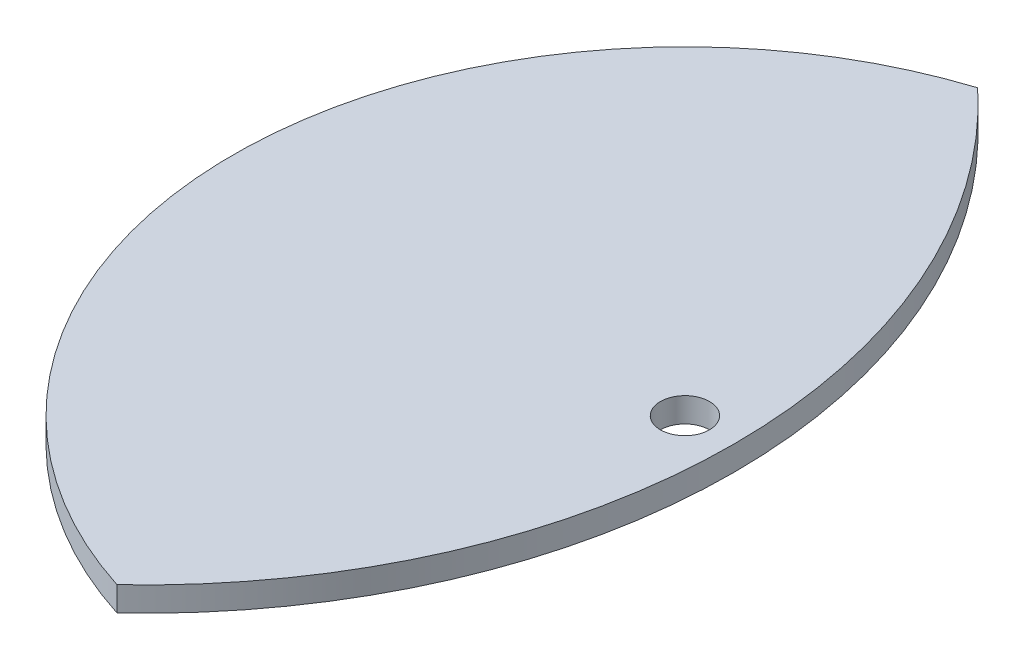
ISO-10303-21;
HEADER;
FILE_DESCRIPTION(('STEP AP214'),'2;1');
FILE_NAME('part.step','',(''),(''),'','','');
FILE_SCHEMA(('AUTOMOTIVE_DESIGN { 1 0 10303 214 1 1 1 1 }'));
ENDSEC;
DATA;
#1=APPLICATION_CONTEXT('core data for automotive mechanical design processes');
#2=APPLICATION_PROTOCOL_DEFINITION('international standard','automotive_design',2000,#1);
#3=PRODUCT_CONTEXT('',#1,'mechanical');
#4=PRODUCT('Part','Part','',(#3));
#5=PRODUCT_RELATED_PRODUCT_CATEGORY('part','',(#4));
#6=PRODUCT_DEFINITION_FORMATION('','',#4);
#7=PRODUCT_DEFINITION_CONTEXT('part definition',#1,'design');
#8=PRODUCT_DEFINITION('design','',#6,#7);
#9=PRODUCT_DEFINITION_SHAPE('','',#8);
#10=(LENGTH_UNIT() NAMED_UNIT(*) SI_UNIT(.MILLI.,.METRE.));
#11=(NAMED_UNIT(*) PLANE_ANGLE_UNIT() SI_UNIT($,.RADIAN.));
#12=(NAMED_UNIT(*) SI_UNIT($,.STERADIAN.) SOLID_ANGLE_UNIT());
#13=UNCERTAINTY_MEASURE_WITH_UNIT(LENGTH_MEASURE(1.E-05),#10,'distance_accuracy_value','');
#14=(GEOMETRIC_REPRESENTATION_CONTEXT(3) GLOBAL_UNCERTAINTY_ASSIGNED_CONTEXT((#13)) GLOBAL_UNIT_ASSIGNED_CONTEXT((#10,
#11,#12)) REPRESENTATION_CONTEXT('',''));
#15=CARTESIAN_POINT('',(0.,0.,0.));
#16=DIRECTION('',(0.,0.,1.));
#17=DIRECTION('',(1.,0.,0.));
#18=AXIS2_PLACEMENT_3D('',#15,#16,#17);
#19=CARTESIAN_POINT('',(34.925,3.175,0.));
#20=DIRECTION('',(0.,1.,0.));
#21=DIRECTION('',(0.,0.,1.));
#22=AXIS2_PLACEMENT_3D('',#19,#20,#21);
#23=PLANE('',#22);
#24=CARTESIAN_POINT('',(0.,3.175,0.));
#25=DIRECTION('',(0.,1.,0.));
#26=DIRECTION('',(0.,0.,1.));
#27=AXIS2_PLACEMENT_3D('',#24,#25,#26);
#28=CIRCLE('',#27,76.2);
#29=CARTESIAN_POINT('',(52.0584545454546,3.175,55.644921694067));
#30=VERTEX_POINT('',#29);
#31=CARTESIAN_POINT('',(52.0584545454545,3.175,-55.644921694067));
#32=VERTEX_POINT('',#31);
#33=EDGE_CURVE('E70',#30,#32,#28,.T.);
#34=ORIENTED_EDGE('',*,*,#33,.T.);
#35=CARTESIAN_POINT('',(69.85,3.175,0.));
#36=DIRECTION('',(0.,1.,0.));
#37=DIRECTION('',(0.,0.,-1.));
#38=AXIS2_PLACEMENT_3D('',#35,#36,#37);
#39=CIRCLE('',#38,58.42);
#40=EDGE_CURVE('E49',#32,#30,#39,.T.);
#41=ORIENTED_EDGE('',*,*,#40,.T.);
#42=EDGE_LOOP('',(#34,#41));
#43=FACE_BOUND('',#42,.T.);
#44=CARTESIAN_POINT('',(69.85,3.175,0.));
#45=DIRECTION('',(0.,1.,0.));
#46=DIRECTION('',(0.,0.,1.));
#47=AXIS2_PLACEMENT_3D('',#44,#45,#46);
#48=CIRCLE('',#47,3.175);
#49=CARTESIAN_POINT('',(69.85,3.175,3.175));
#50=VERTEX_POINT('',#49);
#51=EDGE_CURVE('E65',#50,#50,#48,.T.);
#52=ORIENTED_EDGE('',*,*,#51,.F.);
#53=EDGE_LOOP('',(#52));
#54=FACE_BOUND('',#53,.T.);
#55=ADVANCED_FACE('F33',(#43,#54),#23,.T.);
#56=CARTESIAN_POINT('',(34.925,0.,0.));
#57=DIRECTION('',(0.,1.,0.));
#58=DIRECTION('',(0.,0.,1.));
#59=AXIS2_PLACEMENT_3D('',#56,#57,#58);
#60=PLANE('',#59);
#61=CARTESIAN_POINT('',(0.,0.,0.));
#62=DIRECTION('',(0.,1.,0.));
#63=DIRECTION('',(0.,0.,1.));
#64=AXIS2_PLACEMENT_3D('',#61,#62,#63);
#65=CIRCLE('',#64,76.2);
#66=CARTESIAN_POINT('',(52.0584545454546,0.,55.644921694067));
#67=VERTEX_POINT('',#66);
#68=CARTESIAN_POINT('',(52.0584545454545,0.,-55.644921694067));
#69=VERTEX_POINT('',#68);
#70=EDGE_CURVE('E58',#67,#69,#65,.T.);
#71=ORIENTED_EDGE('',*,*,#70,.F.);
#72=CARTESIAN_POINT('',(69.85,0.,0.));
#73=DIRECTION('',(0.,1.,0.));
#74=DIRECTION('',(0.,0.,-1.));
#75=AXIS2_PLACEMENT_3D('',#72,#73,#74);
#76=CIRCLE('',#75,58.42);
#77=EDGE_CURVE('E64',#69,#67,#76,.T.);
#78=ORIENTED_EDGE('',*,*,#77,.F.);
#79=EDGE_LOOP('',(#71,#78));
#80=FACE_BOUND('',#79,.T.);
#81=CARTESIAN_POINT('',(69.85,0.,0.));
#82=DIRECTION('',(0.,1.,0.));
#83=DIRECTION('',(0.,0.,1.));
#84=AXIS2_PLACEMENT_3D('',#81,#82,#83);
#85=CIRCLE('',#84,3.175);
#86=CARTESIAN_POINT('',(69.85,0.,3.175));
#87=VERTEX_POINT('',#86);
#88=EDGE_CURVE('E75',#87,#87,#85,.T.);
#89=ORIENTED_EDGE('',*,*,#88,.T.);
#90=EDGE_LOOP('',(#89));
#91=FACE_BOUND('',#90,.T.);
#92=ADVANCED_FACE('F62',(#80,#91),#60,.F.);
#93=CARTESIAN_POINT('',(0.,3.175,0.));
#94=DIRECTION('',(0.,-1.,0.));
#95=DIRECTION('',(0.,0.,-1.));
#96=AXIS2_PLACEMENT_3D('',#93,#94,#95);
#97=CYLINDRICAL_SURFACE('',#96,76.2);
#98=ORIENTED_EDGE('',*,*,#70,.T.);
#99=DIRECTION('',(0.,-1.,0.));
#100=VECTOR('',#99,1.);
#101=CARTESIAN_POINT('',(52.0584545454545,3.175,-55.644921694067));
#102=LINE('',#101,#100);
#103=EDGE_CURVE('E11',#32,#69,#102,.T.);
#104=ORIENTED_EDGE('',*,*,#103,.F.);
#105=ORIENTED_EDGE('',*,*,#33,.F.);
#106=DIRECTION('',(0.,-1.,0.));
#107=VECTOR('',#106,1.);
#108=CARTESIAN_POINT('',(52.0584545454546,3.175,55.644921694067));
#109=LINE('',#108,#107);
#110=EDGE_CURVE('E42',#30,#67,#109,.T.);
#111=ORIENTED_EDGE('',*,*,#110,.T.);
#112=EDGE_LOOP('',(#98,#104,#105,#111));
#113=FACE_BOUND('',#112,.T.);
#114=ADVANCED_FACE('F35',(#113),#97,.T.);
#115=CARTESIAN_POINT('',(69.85,3.175,0.));
#116=DIRECTION('',(0.,-1.,0.));
#117=DIRECTION('',(0.,0.,-1.));
#118=AXIS2_PLACEMENT_3D('',#115,#116,#117);
#119=CYLINDRICAL_SURFACE('',#118,58.42);
#120=ORIENTED_EDGE('',*,*,#77,.T.);
#121=ORIENTED_EDGE('',*,*,#110,.F.);
#122=ORIENTED_EDGE('',*,*,#40,.F.);
#123=ORIENTED_EDGE('',*,*,#103,.T.);
#124=EDGE_LOOP('',(#120,#121,#122,#123));
#125=FACE_BOUND('',#124,.T.);
#126=ADVANCED_FACE('F68',(#125),#119,.T.);
#127=CARTESIAN_POINT('',(69.85,3.175,0.));
#128=DIRECTION('',(0.,-1.,0.));
#129=DIRECTION('',(0.,0.,-1.));
#130=AXIS2_PLACEMENT_3D('',#127,#128,#129);
#131=CYLINDRICAL_SURFACE('',#130,3.175);
#132=ORIENTED_EDGE('',*,*,#51,.T.);
#133=EDGE_LOOP('',(#132));
#134=FACE_BOUND('',#133,.T.);
#135=ORIENTED_EDGE('',*,*,#88,.F.);
#136=EDGE_LOOP('',(#135));
#137=FACE_BOUND('',#136,.T.);
#138=ADVANCED_FACE('F81',(#134,#137),#131,.F.);
#139=CLOSED_SHELL('',(#55,#92,#114,#126,#138));
#140=MANIFOLD_SOLID_BREP('B2',#139);
#141=ADVANCED_BREP_SHAPE_REPRESENTATION('',(#18,#140),#14);
#142=SHAPE_DEFINITION_REPRESENTATION(#9,#141);
ENDSEC;
END-ISO-10303-21;
